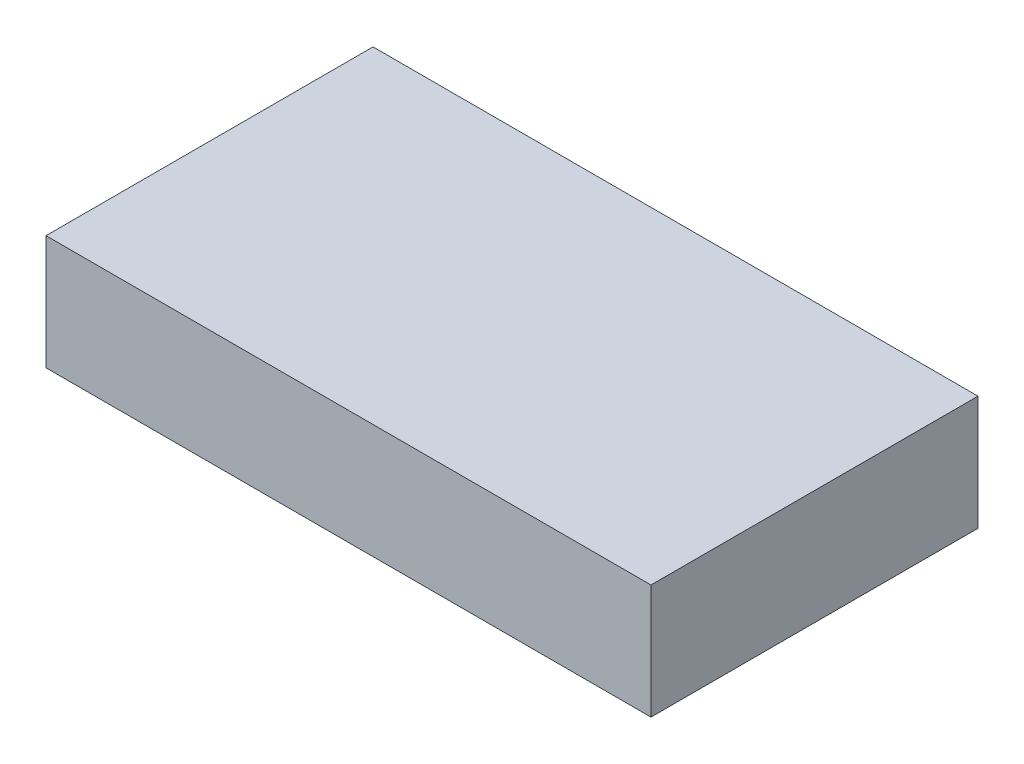
ISO-10303-21;
HEADER;
FILE_DESCRIPTION(('STEP AP214'),'2;1');
FILE_NAME('part.step','',(''),(''),'','','');
FILE_SCHEMA(('AUTOMOTIVE_DESIGN { 1 0 10303 214 1 1 1 1 }'));
ENDSEC;
DATA;
#1=APPLICATION_CONTEXT('core data for automotive mechanical design processes');
#2=APPLICATION_PROTOCOL_DEFINITION('international standard','automotive_design',2000,#1);
#3=PRODUCT_CONTEXT('',#1,'mechanical');
#4=PRODUCT('Part','Part','',(#3));
#5=PRODUCT_RELATED_PRODUCT_CATEGORY('part','',(#4));
#6=PRODUCT_DEFINITION_FORMATION('','',#4);
#7=PRODUCT_DEFINITION_CONTEXT('part definition',#1,'design');
#8=PRODUCT_DEFINITION('design','',#6,#7);
#9=PRODUCT_DEFINITION_SHAPE('','',#8);
#10=(LENGTH_UNIT() NAMED_UNIT(*) SI_UNIT(.MILLI.,.METRE.));
#11=(NAMED_UNIT(*) PLANE_ANGLE_UNIT() SI_UNIT($,.RADIAN.));
#12=(NAMED_UNIT(*) SI_UNIT($,.STERADIAN.) SOLID_ANGLE_UNIT());
#13=UNCERTAINTY_MEASURE_WITH_UNIT(LENGTH_MEASURE(1.E-05),#10,'distance_accuracy_value','');
#14=(GEOMETRIC_REPRESENTATION_CONTEXT(3) GLOBAL_UNCERTAINTY_ASSIGNED_CONTEXT((#13)) GLOBAL_UNIT_ASSIGNED_CONTEXT((#10,
#11,#12)) REPRESENTATION_CONTEXT('',''));
#15=CARTESIAN_POINT('',(0.,0.,0.));
#16=DIRECTION('',(0.,0.,1.));
#17=DIRECTION('',(1.,0.,0.));
#18=AXIS2_PLACEMENT_3D('',#15,#16,#17);
#19=CARTESIAN_POINT('',(0.,35.,0.));
#20=DIRECTION('',(1.,0.,0.));
#21=DIRECTION('',(0.,0.,-1.));
#22=AXIS2_PLACEMENT_3D('',#19,#20,#21);
#23=PLANE('',#22);
#24=DIRECTION('',(0.,0.,1.));
#25=VECTOR('',#24,1.);
#26=CARTESIAN_POINT('',(0.,0.,0.));
#27=LINE('',#26,#25);
#28=CARTESIAN_POINT('',(0.,0.,-100.));
#29=VERTEX_POINT('',#28);
#30=CARTESIAN_POINT('',(0.,0.,0.));
#31=VERTEX_POINT('',#30);
#32=EDGE_CURVE('E93',#29,#31,#27,.T.);
#33=ORIENTED_EDGE('',*,*,#32,.T.);
#34=DIRECTION('',(0.,-1.,0.));
#35=VECTOR('',#34,1.);
#36=CARTESIAN_POINT('',(0.,35.,0.));
#37=LINE('',#36,#35);
#38=CARTESIAN_POINT('',(0.,35.,0.));
#39=VERTEX_POINT('',#38);
#40=EDGE_CURVE('E11',#39,#31,#37,.T.);
#41=ORIENTED_EDGE('',*,*,#40,.F.);
#42=DIRECTION('',(0.,0.,1.));
#43=VECTOR('',#42,1.);
#44=CARTESIAN_POINT('',(0.,35.,0.));
#45=LINE('',#44,#43);
#46=CARTESIAN_POINT('',(0.,35.,-100.));
#47=VERTEX_POINT('',#46);
#48=EDGE_CURVE('E81',#47,#39,#45,.T.);
#49=ORIENTED_EDGE('',*,*,#48,.F.);
#50=DIRECTION('',(0.,-1.,0.));
#51=VECTOR('',#50,1.);
#52=CARTESIAN_POINT('',(0.,35.,-100.));
#53=LINE('',#52,#51);
#54=EDGE_CURVE('E89',#47,#29,#53,.T.);
#55=ORIENTED_EDGE('',*,*,#54,.T.);
#56=EDGE_LOOP('',(#33,#41,#49,#55));
#57=FACE_BOUND('',#56,.T.);
#58=ADVANCED_FACE('F30',(#57),#23,.F.);
#59=CARTESIAN_POINT('',(0.,35.,0.));
#60=DIRECTION('',(0.,0.,-1.));
#61=DIRECTION('',(-1.,0.,0.));
#62=AXIS2_PLACEMENT_3D('',#59,#60,#61);
#63=PLANE('',#62);
#64=DIRECTION('',(1.,0.,0.));
#65=VECTOR('',#64,1.);
#66=CARTESIAN_POINT('',(0.,0.,0.));
#67=LINE('',#66,#65);
#68=CARTESIAN_POINT('',(185.,0.,0.));
#69=VERTEX_POINT('',#68);
#70=EDGE_CURVE('E85',#31,#69,#67,.T.);
#71=ORIENTED_EDGE('',*,*,#70,.T.);
#72=DIRECTION('',(0.,-1.,0.));
#73=VECTOR('',#72,1.);
#74=CARTESIAN_POINT('',(185.,35.,0.));
#75=LINE('',#74,#73);
#76=CARTESIAN_POINT('',(185.,35.,0.));
#77=VERTEX_POINT('',#76);
#78=EDGE_CURVE('E38',#77,#69,#75,.T.);
#79=ORIENTED_EDGE('',*,*,#78,.F.);
#80=DIRECTION('',(1.,0.,0.));
#81=VECTOR('',#80,1.);
#82=CARTESIAN_POINT('',(0.,35.,0.));
#83=LINE('',#82,#81);
#84=EDGE_CURVE('E76',#39,#77,#83,.T.);
#85=ORIENTED_EDGE('',*,*,#84,.F.);
#86=ORIENTED_EDGE('',*,*,#40,.T.);
#87=EDGE_LOOP('',(#71,#79,#85,#86));
#88=FACE_BOUND('',#87,.T.);
#89=ADVANCED_FACE('F84',(#88),#63,.F.);
#90=CARTESIAN_POINT('',(185.,35.,0.));
#91=DIRECTION('',(-1.,0.,0.));
#92=DIRECTION('',(0.,0.,1.));
#93=AXIS2_PLACEMENT_3D('',#90,#91,#92);
#94=PLANE('',#93);
#95=DIRECTION('',(0.,0.,-1.));
#96=VECTOR('',#95,1.);
#97=CARTESIAN_POINT('',(185.,0.,0.));
#98=LINE('',#97,#96);
#99=CARTESIAN_POINT('',(185.,0.,-100.));
#100=VERTEX_POINT('',#99);
#101=EDGE_CURVE('E63',#69,#100,#98,.T.);
#102=ORIENTED_EDGE('',*,*,#101,.T.);
#103=DIRECTION('',(0.,-1.,0.));
#104=VECTOR('',#103,1.);
#105=CARTESIAN_POINT('',(185.,35.,-100.));
#106=LINE('',#105,#104);
#107=CARTESIAN_POINT('',(185.,35.,-100.));
#108=VERTEX_POINT('',#107);
#109=EDGE_CURVE('E86',#108,#100,#106,.T.);
#110=ORIENTED_EDGE('',*,*,#109,.F.);
#111=DIRECTION('',(0.,0.,-1.));
#112=VECTOR('',#111,1.);
#113=CARTESIAN_POINT('',(185.,35.,0.));
#114=LINE('',#113,#112);
#115=EDGE_CURVE('E79',#77,#108,#114,.T.);
#116=ORIENTED_EDGE('',*,*,#115,.F.);
#117=ORIENTED_EDGE('',*,*,#78,.T.);
#118=EDGE_LOOP('',(#102,#110,#116,#117));
#119=FACE_BOUND('',#118,.T.);
#120=ADVANCED_FACE('F87',(#119),#94,.F.);
#121=CARTESIAN_POINT('',(0.,35.,-100.));
#122=DIRECTION('',(0.,0.,1.));
#123=DIRECTION('',(1.,0.,0.));
#124=AXIS2_PLACEMENT_3D('',#121,#122,#123);
#125=PLANE('',#124);
#126=DIRECTION('',(-1.,0.,0.));
#127=VECTOR('',#126,1.);
#128=CARTESIAN_POINT('',(0.,0.,-100.));
#129=LINE('',#128,#127);
#130=EDGE_CURVE('E69',#100,#29,#129,.T.);
#131=ORIENTED_EDGE('',*,*,#130,.T.);
#132=ORIENTED_EDGE('',*,*,#54,.F.);
#133=DIRECTION('',(-1.,0.,0.));
#134=VECTOR('',#133,1.);
#135=CARTESIAN_POINT('',(0.,35.,-100.));
#136=LINE('',#135,#134);
#137=EDGE_CURVE('E46',#108,#47,#136,.T.);
#138=ORIENTED_EDGE('',*,*,#137,.F.);
#139=ORIENTED_EDGE('',*,*,#109,.T.);
#140=EDGE_LOOP('',(#131,#132,#138,#139));
#141=FACE_BOUND('',#140,.T.);
#142=ADVANCED_FACE('F100',(#141),#125,.F.);
#143=CARTESIAN_POINT('',(0.,35.,-100.));
#144=DIRECTION('',(0.,-1.,0.));
#145=DIRECTION('',(0.,0.,-1.));
#146=AXIS2_PLACEMENT_3D('',#143,#144,#145);
#147=PLANE('',#146);
#148=ORIENTED_EDGE('',*,*,#48,.T.);
#149=ORIENTED_EDGE('',*,*,#84,.T.);
#150=ORIENTED_EDGE('',*,*,#115,.T.);
#151=ORIENTED_EDGE('',*,*,#137,.T.);
#152=EDGE_LOOP('',(#148,#149,#150,#151));
#153=FACE_BOUND('',#152,.T.);
#154=ADVANCED_FACE('F77',(#153),#147,.F.);
#155=CARTESIAN_POINT('',(0.,0.,-100.));
#156=DIRECTION('',(0.,-1.,0.));
#157=DIRECTION('',(0.,0.,-1.));
#158=AXIS2_PLACEMENT_3D('',#155,#156,#157);
#159=PLANE('',#158);
#160=ORIENTED_EDGE('',*,*,#32,.F.);
#161=ORIENTED_EDGE('',*,*,#130,.F.);
#162=ORIENTED_EDGE('',*,*,#101,.F.);
#163=ORIENTED_EDGE('',*,*,#70,.F.);
#164=EDGE_LOOP('',(#160,#161,#162,#163));
#165=FACE_BOUND('',#164,.T.);
#166=ADVANCED_FACE('F103',(#165),#159,.T.);
#167=CLOSED_SHELL('',(#58,#89,#120,#142,#154,#166));
#168=MANIFOLD_SOLID_BREP('B2',#167);
#169=ADVANCED_BREP_SHAPE_REPRESENTATION('',(#18,#168),#14);
#170=SHAPE_DEFINITION_REPRESENTATION(#9,#169);
ENDSEC;
END-ISO-10303-21;
